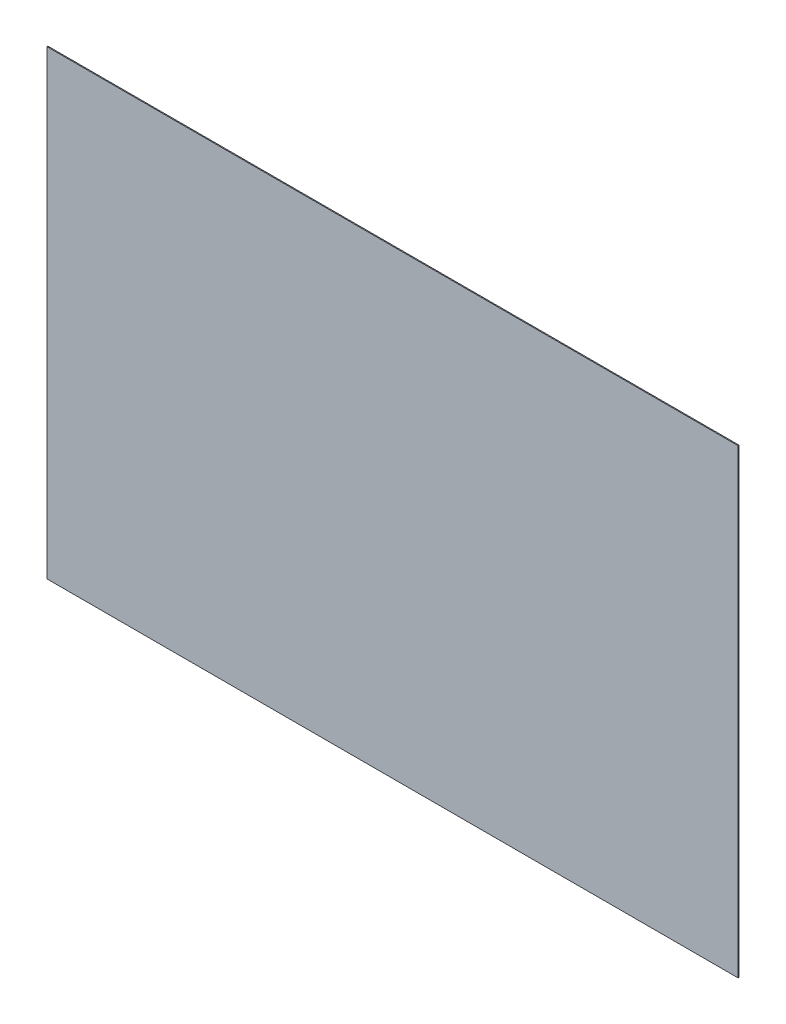
ISO-10303-21;
HEADER;
FILE_DESCRIPTION(('STEP AP214'),'2;1');
FILE_NAME('part.step','',(''),(''),'','','');
FILE_SCHEMA(('AUTOMOTIVE_DESIGN { 1 0 10303 214 1 1 1 1 }'));
ENDSEC;
DATA;
#1=APPLICATION_CONTEXT('core data for automotive mechanical design processes');
#2=APPLICATION_PROTOCOL_DEFINITION('international standard','automotive_design',2000,#1);
#3=PRODUCT_CONTEXT('',#1,'mechanical');
#4=PRODUCT('Part','Part','',(#3));
#5=PRODUCT_RELATED_PRODUCT_CATEGORY('part','',(#4));
#6=PRODUCT_DEFINITION_FORMATION('','',#4);
#7=PRODUCT_DEFINITION_CONTEXT('part definition',#1,'design');
#8=PRODUCT_DEFINITION('design','',#6,#7);
#9=PRODUCT_DEFINITION_SHAPE('','',#8);
#10=(LENGTH_UNIT() NAMED_UNIT(*) SI_UNIT(.MILLI.,.METRE.));
#11=(NAMED_UNIT(*) PLANE_ANGLE_UNIT() SI_UNIT($,.RADIAN.));
#12=(NAMED_UNIT(*) SI_UNIT($,.STERADIAN.) SOLID_ANGLE_UNIT());
#13=UNCERTAINTY_MEASURE_WITH_UNIT(LENGTH_MEASURE(1.E-05),#10,'distance_accuracy_value','');
#14=(GEOMETRIC_REPRESENTATION_CONTEXT(3) GLOBAL_UNCERTAINTY_ASSIGNED_CONTEXT((#13)) GLOBAL_UNIT_ASSIGNED_CONTEXT((#10,
#11,#12)) REPRESENTATION_CONTEXT('',''));
#15=CARTESIAN_POINT('',(0.,0.,0.));
#16=DIRECTION('',(0.,0.,1.));
#17=DIRECTION('',(1.,0.,0.));
#18=AXIS2_PLACEMENT_3D('',#15,#16,#17);
#19=CARTESIAN_POINT('',(29.2500000000001,-33.0599999999996,0.));
#20=DIRECTION('',(0.,0.,-1.));
#21=DIRECTION('',(-1.,0.,0.));
#22=AXIS2_PLACEMENT_3D('',#19,#20,#21);
#23=PLANE('',#22);
#24=DIRECTION('',(0.,1.,0.));
#25=VECTOR('',#24,1.);
#26=CARTESIAN_POINT('',(-44.1899999999999,15.9000000000003,0.));
#27=LINE('',#26,#25);
#28=CARTESIAN_POINT('',(-44.1899999999999,-33.0599999999996,0.));
#29=VERTEX_POINT('',#28);
#30=CARTESIAN_POINT('',(-44.1899999999999,15.9000000000003,0.));
#31=VERTEX_POINT('',#30);
#32=EDGE_CURVE('E55',#29,#31,#27,.T.);
#33=ORIENTED_EDGE('',*,*,#32,.T.);
#34=DIRECTION('',(1.,0.,0.));
#35=VECTOR('',#34,1.);
#36=CARTESIAN_POINT('',(29.2500000000001,15.9000000000004,0.));
#37=LINE('',#36,#35);
#38=CARTESIAN_POINT('',(29.2500000000001,15.9000000000004,0.));
#39=VERTEX_POINT('',#38);
#40=EDGE_CURVE('E76',#31,#39,#37,.T.);
#41=ORIENTED_EDGE('',*,*,#40,.T.);
#42=DIRECTION('',(0.,-1.,0.));
#43=VECTOR('',#42,1.);
#44=CARTESIAN_POINT('',(29.2500000000001,15.9000000000004,0.));
#45=LINE('',#44,#43);
#46=CARTESIAN_POINT('',(29.2500000000001,-33.0599999999996,0.));
#47=VERTEX_POINT('',#46);
#48=EDGE_CURVE('E58',#39,#47,#45,.T.);
#49=ORIENTED_EDGE('',*,*,#48,.T.);
#50=DIRECTION('',(-1.,0.,0.));
#51=VECTOR('',#50,1.);
#52=CARTESIAN_POINT('',(29.2500000000001,-33.0599999999996,0.));
#53=LINE('',#52,#51);
#54=EDGE_CURVE('E20',#47,#29,#53,.T.);
#55=ORIENTED_EDGE('',*,*,#54,.T.);
#56=EDGE_LOOP('',(#33,#41,#49,#55));
#57=FACE_BOUND('',#56,.T.);
#58=ADVANCED_FACE('F17',(#57),#23,.T.);
#59=CARTESIAN_POINT('',(29.2500000000001,-33.0599999999996,0.1));
#60=DIRECTION('',(0.,1.,0.));
#61=DIRECTION('',(-1.,0.,0.));
#62=AXIS2_PLACEMENT_3D('',#59,#60,#61);
#63=PLANE('',#62);
#64=DIRECTION('',(0.,0.,1.));
#65=VECTOR('',#64,1.);
#66=CARTESIAN_POINT('',(29.2500000000001,-33.0599999999996,0.1));
#67=LINE('',#66,#65);
#68=CARTESIAN_POINT('',(29.2500000000001,-33.0599999999996,0.1));
#69=VERTEX_POINT('',#68);
#70=EDGE_CURVE('E78',#47,#69,#67,.T.);
#71=ORIENTED_EDGE('',*,*,#70,.T.);
#72=DIRECTION('',(-1.,0.,0.));
#73=VECTOR('',#72,1.);
#74=CARTESIAN_POINT('',(29.2500000000001,-33.0599999999996,0.1));
#75=LINE('',#74,#73);
#76=CARTESIAN_POINT('',(-44.1899999999999,-33.0599999999996,0.1));
#77=VERTEX_POINT('',#76);
#78=EDGE_CURVE('E73',#69,#77,#75,.T.);
#79=ORIENTED_EDGE('',*,*,#78,.T.);
#80=DIRECTION('',(0.,0.,1.));
#81=VECTOR('',#80,1.);
#82=CARTESIAN_POINT('',(-44.1899999999999,-33.0599999999997,0.1));
#83=LINE('',#82,#81);
#84=EDGE_CURVE('E63',#77,#29,#83,.F.);
#85=ORIENTED_EDGE('',*,*,#84,.T.);
#86=ORIENTED_EDGE('',*,*,#54,.F.);
#87=EDGE_LOOP('',(#71,#79,#85,#86));
#88=FACE_BOUND('',#87,.T.);
#89=ADVANCED_FACE('F72',(#88),#63,.F.);
#90=CARTESIAN_POINT('',(-44.1899999999999,15.9000000000003,0.1));
#91=DIRECTION('',(1.,0.,0.));
#92=DIRECTION('',(0.,1.,0.));
#93=AXIS2_PLACEMENT_3D('',#90,#91,#92);
#94=PLANE('',#93);
#95=ORIENTED_EDGE('',*,*,#84,.F.);
#96=DIRECTION('',(0.,1.,0.));
#97=VECTOR('',#96,1.);
#98=CARTESIAN_POINT('',(-44.1899999999999,-33.0599999999996,0.1));
#99=LINE('',#98,#97);
#100=CARTESIAN_POINT('',(-44.1899999999999,15.9000000000003,0.1));
#101=VERTEX_POINT('',#100);
#102=EDGE_CURVE('E83',#77,#101,#99,.T.);
#103=ORIENTED_EDGE('',*,*,#102,.T.);
#104=DIRECTION('',(0.,0.,1.));
#105=VECTOR('',#104,1.);
#106=CARTESIAN_POINT('',(-44.1899999999999,15.9000000000003,0.1));
#107=LINE('',#106,#105);
#108=EDGE_CURVE('E69',#101,#31,#107,.F.);
#109=ORIENTED_EDGE('',*,*,#108,.T.);
#110=ORIENTED_EDGE('',*,*,#32,.F.);
#111=EDGE_LOOP('',(#95,#103,#109,#110));
#112=FACE_BOUND('',#111,.T.);
#113=ADVANCED_FACE('F66',(#112),#94,.F.);
#114=CARTESIAN_POINT('',(29.2500000000001,15.9000000000004,0.1));
#115=DIRECTION('',(0.,-1.,0.));
#116=DIRECTION('',(1.,0.,0.));
#117=AXIS2_PLACEMENT_3D('',#114,#115,#116);
#118=PLANE('',#117);
#119=ORIENTED_EDGE('',*,*,#108,.F.);
#120=DIRECTION('',(-1.,0.,0.));
#121=VECTOR('',#120,1.);
#122=CARTESIAN_POINT('',(29.2500000000001,15.9000000000003,0.1));
#123=LINE('',#122,#121);
#124=CARTESIAN_POINT('',(29.2500000000001,15.9000000000004,0.1));
#125=VERTEX_POINT('',#124);
#126=EDGE_CURVE('E26',#101,#125,#123,.F.);
#127=ORIENTED_EDGE('',*,*,#126,.T.);
#128=DIRECTION('',(0.,0.,1.));
#129=VECTOR('',#128,1.);
#130=CARTESIAN_POINT('',(29.2500000000001,15.9000000000004,0.1));
#131=LINE('',#130,#129);
#132=EDGE_CURVE('E34',#125,#39,#131,.F.);
#133=ORIENTED_EDGE('',*,*,#132,.T.);
#134=ORIENTED_EDGE('',*,*,#40,.F.);
#135=EDGE_LOOP('',(#119,#127,#133,#134));
#136=FACE_BOUND('',#135,.T.);
#137=ADVANCED_FACE('F88',(#136),#118,.F.);
#138=CARTESIAN_POINT('',(29.2500000000001,15.9000000000004,0.1));
#139=DIRECTION('',(-1.,0.,0.));
#140=DIRECTION('',(0.,-1.,0.));
#141=AXIS2_PLACEMENT_3D('',#138,#139,#140);
#142=PLANE('',#141);
#143=ORIENTED_EDGE('',*,*,#132,.F.);
#144=DIRECTION('',(0.,1.,0.));
#145=VECTOR('',#144,1.);
#146=CARTESIAN_POINT('',(29.2500000000001,-33.0599999999996,0.1));
#147=LINE('',#146,#145);
#148=EDGE_CURVE('E11',#125,#69,#147,.F.);
#149=ORIENTED_EDGE('',*,*,#148,.T.);
#150=ORIENTED_EDGE('',*,*,#70,.F.);
#151=ORIENTED_EDGE('',*,*,#48,.F.);
#152=EDGE_LOOP('',(#143,#149,#150,#151));
#153=FACE_BOUND('',#152,.T.);
#154=ADVANCED_FACE('F91',(#153),#142,.F.);
#155=CARTESIAN_POINT('',(29.2500000000001,-33.0599999999996,0.1));
#156=DIRECTION('',(0.,0.,-1.));
#157=DIRECTION('',(-1.,0.,0.));
#158=AXIS2_PLACEMENT_3D('',#155,#156,#157);
#159=PLANE('',#158);
#160=ORIENTED_EDGE('',*,*,#126,.F.);
#161=ORIENTED_EDGE('',*,*,#102,.F.);
#162=ORIENTED_EDGE('',*,*,#78,.F.);
#163=ORIENTED_EDGE('',*,*,#148,.F.);
#164=EDGE_LOOP('',(#160,#161,#162,#163));
#165=FACE_BOUND('',#164,.T.);
#166=ADVANCED_FACE('F90',(#165),#159,.F.);
#167=CLOSED_SHELL('',(#58,#89,#113,#137,#154,#166));
#168=MANIFOLD_SOLID_BREP('B1',#167);
#169=ADVANCED_BREP_SHAPE_REPRESENTATION('',(#18,#168),#14);
#170=SHAPE_DEFINITION_REPRESENTATION(#9,#169);
ENDSEC;
END-ISO-10303-21;
